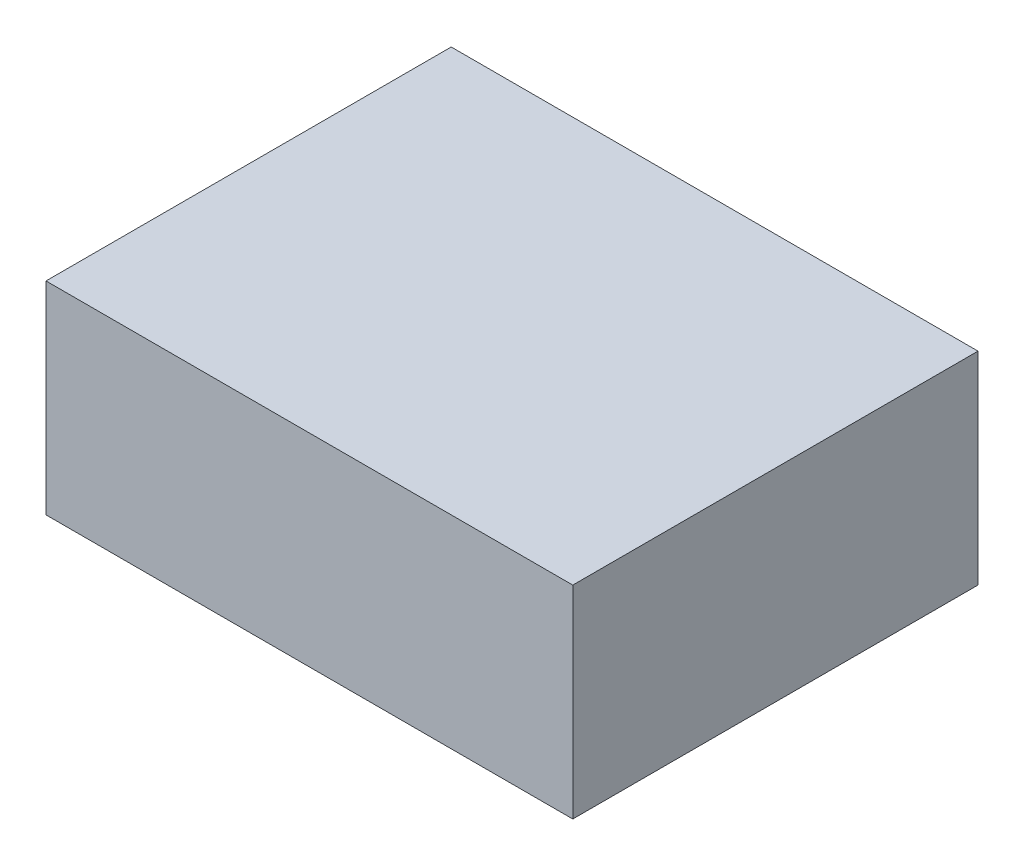
ISO-10303-21;
HEADER;
FILE_DESCRIPTION(('STEP AP214'),'2;1');
FILE_NAME('part.step','',(''),(''),'','','');
FILE_SCHEMA(('AUTOMOTIVE_DESIGN { 1 0 10303 214 1 1 1 1 }'));
ENDSEC;
DATA;
#1=APPLICATION_CONTEXT('core data for automotive mechanical design processes');
#2=APPLICATION_PROTOCOL_DEFINITION('international standard','automotive_design',2000,#1);
#3=PRODUCT_CONTEXT('',#1,'mechanical');
#4=PRODUCT('Part','Part','',(#3));
#5=PRODUCT_RELATED_PRODUCT_CATEGORY('part','',(#4));
#6=PRODUCT_DEFINITION_FORMATION('','',#4);
#7=PRODUCT_DEFINITION_CONTEXT('part definition',#1,'design');
#8=PRODUCT_DEFINITION('design','',#6,#7);
#9=PRODUCT_DEFINITION_SHAPE('','',#8);
#10=(LENGTH_UNIT() NAMED_UNIT(*) SI_UNIT(.MILLI.,.METRE.));
#11=(NAMED_UNIT(*) PLANE_ANGLE_UNIT() SI_UNIT($,.RADIAN.));
#12=(NAMED_UNIT(*) SI_UNIT($,.STERADIAN.) SOLID_ANGLE_UNIT());
#13=UNCERTAINTY_MEASURE_WITH_UNIT(LENGTH_MEASURE(1.E-05),#10,'distance_accuracy_value','');
#14=(GEOMETRIC_REPRESENTATION_CONTEXT(3) GLOBAL_UNCERTAINTY_ASSIGNED_CONTEXT((#13)) GLOBAL_UNIT_ASSIGNED_CONTEXT((#10,
#11,#12)) REPRESENTATION_CONTEXT('',''));
#15=CARTESIAN_POINT('',(0.,0.,0.));
#16=DIRECTION('',(0.,0.,1.));
#17=DIRECTION('',(1.,0.,0.));
#18=AXIS2_PLACEMENT_3D('',#15,#16,#17);
#19=CARTESIAN_POINT('',(32.5,25.,25.));
#20=DIRECTION('',(-1.,0.,0.));
#21=DIRECTION('',(0.,0.,1.));
#22=AXIS2_PLACEMENT_3D('',#19,#20,#21);
#23=PLANE('',#22);
#24=DIRECTION('',(0.,0.,-1.));
#25=VECTOR('',#24,1.);
#26=CARTESIAN_POINT('',(32.5,0.,25.));
#27=LINE('',#26,#25);
#28=CARTESIAN_POINT('',(32.5,0.,25.));
#29=VERTEX_POINT('',#28);
#30=CARTESIAN_POINT('',(32.5,0.,-25.));
#31=VERTEX_POINT('',#30);
#32=EDGE_CURVE('E103',#29,#31,#27,.T.);
#33=ORIENTED_EDGE('',*,*,#32,.T.);
#34=DIRECTION('',(0.,-1.,0.));
#35=VECTOR('',#34,1.);
#36=CARTESIAN_POINT('',(32.5,25.,-25.));
#37=LINE('',#36,#35);
#38=CARTESIAN_POINT('',(32.5,25.,-25.));
#39=VERTEX_POINT('',#38);
#40=EDGE_CURVE('E45',#39,#31,#37,.T.);
#41=ORIENTED_EDGE('',*,*,#40,.F.);
#42=DIRECTION('',(0.,0.,-1.));
#43=VECTOR('',#42,1.);
#44=CARTESIAN_POINT('',(32.5,25.,25.));
#45=LINE('',#44,#43);
#46=CARTESIAN_POINT('',(32.5,25.,25.));
#47=VERTEX_POINT('',#46);
#48=EDGE_CURVE('E89',#47,#39,#45,.T.);
#49=ORIENTED_EDGE('',*,*,#48,.F.);
#50=DIRECTION('',(0.,-1.,0.));
#51=VECTOR('',#50,1.);
#52=CARTESIAN_POINT('',(32.5,25.,25.));
#53=LINE('',#52,#51);
#54=EDGE_CURVE('E99',#47,#29,#53,.T.);
#55=ORIENTED_EDGE('',*,*,#54,.T.);
#56=EDGE_LOOP('',(#33,#41,#49,#55));
#57=FACE_BOUND('',#56,.T.);
#58=ADVANCED_FACE('F37',(#57),#23,.F.);
#59=CARTESIAN_POINT('',(-32.5,25.,-25.));
#60=DIRECTION('',(0.,0.,1.));
#61=DIRECTION('',(1.,0.,0.));
#62=AXIS2_PLACEMENT_3D('',#59,#60,#61);
#63=PLANE('',#62);
#64=DIRECTION('',(-1.,0.,0.));
#65=VECTOR('',#64,1.);
#66=CARTESIAN_POINT('',(-32.5,0.,-25.));
#67=LINE('',#66,#65);
#68=CARTESIAN_POINT('',(-32.5,0.,-25.));
#69=VERTEX_POINT('',#68);
#70=EDGE_CURVE('E94',#31,#69,#67,.T.);
#71=ORIENTED_EDGE('',*,*,#70,.T.);
#72=DIRECTION('',(0.,-1.,0.));
#73=VECTOR('',#72,1.);
#74=CARTESIAN_POINT('',(-32.5,25.,-25.));
#75=LINE('',#74,#73);
#76=CARTESIAN_POINT('',(-32.5,25.,-25.));
#77=VERTEX_POINT('',#76);
#78=EDGE_CURVE('E92',#77,#69,#75,.T.);
#79=ORIENTED_EDGE('',*,*,#78,.F.);
#80=DIRECTION('',(-1.,0.,0.));
#81=VECTOR('',#80,1.);
#82=CARTESIAN_POINT('',(-32.5,25.,-25.));
#83=LINE('',#82,#81);
#84=EDGE_CURVE('E84',#39,#77,#83,.T.);
#85=ORIENTED_EDGE('',*,*,#84,.F.);
#86=ORIENTED_EDGE('',*,*,#40,.T.);
#87=EDGE_LOOP('',(#71,#79,#85,#86));
#88=FACE_BOUND('',#87,.T.);
#89=ADVANCED_FACE('F93',(#88),#63,.F.);
#90=CARTESIAN_POINT('',(-32.5,25.,25.));
#91=DIRECTION('',(1.,0.,0.));
#92=DIRECTION('',(0.,0.,-1.));
#93=AXIS2_PLACEMENT_3D('',#90,#91,#92);
#94=PLANE('',#93);
#95=DIRECTION('',(0.,0.,1.));
#96=VECTOR('',#95,1.);
#97=CARTESIAN_POINT('',(-32.5,0.,25.));
#98=LINE('',#97,#96);
#99=CARTESIAN_POINT('',(-32.5,0.,25.));
#100=VERTEX_POINT('',#99);
#101=EDGE_CURVE('E70',#69,#100,#98,.T.);
#102=ORIENTED_EDGE('',*,*,#101,.T.);
#103=DIRECTION('',(0.,-1.,0.));
#104=VECTOR('',#103,1.);
#105=CARTESIAN_POINT('',(-32.5,25.,25.));
#106=LINE('',#105,#104);
#107=CARTESIAN_POINT('',(-32.5,25.,25.));
#108=VERTEX_POINT('',#107);
#109=EDGE_CURVE('E95',#108,#100,#106,.T.);
#110=ORIENTED_EDGE('',*,*,#109,.F.);
#111=DIRECTION('',(0.,0.,1.));
#112=VECTOR('',#111,1.);
#113=CARTESIAN_POINT('',(-32.5,25.,25.));
#114=LINE('',#113,#112);
#115=EDGE_CURVE('E87',#77,#108,#114,.T.);
#116=ORIENTED_EDGE('',*,*,#115,.F.);
#117=ORIENTED_EDGE('',*,*,#78,.T.);
#118=EDGE_LOOP('',(#102,#110,#116,#117));
#119=FACE_BOUND('',#118,.T.);
#120=ADVANCED_FACE('F97',(#119),#94,.F.);
#121=CARTESIAN_POINT('',(-32.5,25.,25.));
#122=DIRECTION('',(0.,0.,-1.));
#123=DIRECTION('',(-1.,0.,0.));
#124=AXIS2_PLACEMENT_3D('',#121,#122,#123);
#125=PLANE('',#124);
#126=DIRECTION('',(1.,0.,0.));
#127=VECTOR('',#126,1.);
#128=CARTESIAN_POINT('',(-32.5,0.,25.));
#129=LINE('',#128,#127);
#130=EDGE_CURVE('E76',#100,#29,#129,.T.);
#131=ORIENTED_EDGE('',*,*,#130,.T.);
#132=ORIENTED_EDGE('',*,*,#54,.F.);
#133=DIRECTION('',(1.,0.,0.));
#134=VECTOR('',#133,1.);
#135=CARTESIAN_POINT('',(-32.5,25.,25.));
#136=LINE('',#135,#134);
#137=EDGE_CURVE('E53',#108,#47,#136,.T.);
#138=ORIENTED_EDGE('',*,*,#137,.F.);
#139=ORIENTED_EDGE('',*,*,#109,.T.);
#140=EDGE_LOOP('',(#131,#132,#138,#139));
#141=FACE_BOUND('',#140,.T.);
#142=ADVANCED_FACE('F127',(#141),#125,.F.);
#143=CARTESIAN_POINT('',(0.,25.,0.));
#144=DIRECTION('',(0.,-1.,0.));
#145=DIRECTION('',(0.,0.,-1.));
#146=AXIS2_PLACEMENT_3D('',#143,#144,#145);
#147=PLANE('',#146);
#148=ORIENTED_EDGE('',*,*,#48,.T.);
#149=ORIENTED_EDGE('',*,*,#84,.T.);
#150=ORIENTED_EDGE('',*,*,#115,.T.);
#151=ORIENTED_EDGE('',*,*,#137,.T.);
#152=EDGE_LOOP('',(#148,#149,#150,#151));
#153=FACE_BOUND('',#152,.T.);
#154=ADVANCED_FACE('F85',(#153),#147,.F.);
#155=CARTESIAN_POINT('',(0.,0.,0.));
#156=DIRECTION('',(0.,-1.,0.));
#157=DIRECTION('',(0.,0.,-1.));
#158=AXIS2_PLACEMENT_3D('',#155,#156,#157);
#159=PLANE('',#158);
#160=CARTESIAN_POINT('',(-17.5,0.,0.));
#161=DIRECTION('',(0.,-1.,0.));
#162=DIRECTION('',(0.,0.,-1.));
#163=AXIS2_PLACEMENT_3D('',#160,#161,#162);
#164=CIRCLE('',#163,10.);
#165=CARTESIAN_POINT('',(-17.5,0.,-10.));
#166=VERTEX_POINT('',#165);
#167=EDGE_CURVE('E195',#166,#166,#164,.T.);
#168=ORIENTED_EDGE('',*,*,#167,.F.);
#169=EDGE_LOOP('',(#168));
#170=FACE_BOUND('',#169,.T.);
#171=ORIENTED_EDGE('',*,*,#32,.F.);
#172=ORIENTED_EDGE('',*,*,#130,.F.);
#173=ORIENTED_EDGE('',*,*,#101,.F.);
#174=ORIENTED_EDGE('',*,*,#70,.F.);
#175=EDGE_LOOP('',(#171,#172,#173,#174));
#176=FACE_BOUND('',#175,.T.);
#177=ADVANCED_FACE('F114',(#170,#176),#159,.T.);
#178=CARTESIAN_POINT('',(-17.5,-10.,0.));
#179=DIRECTION('',(0.,-1.,0.));
#180=DIRECTION('',(0.,0.,-1.));
#181=AXIS2_PLACEMENT_3D('',#178,#179,#180);
#182=PLANE('',#181);
#183=CARTESIAN_POINT('',(-17.5,-10.,0.));
#184=DIRECTION('',(0.,-1.,0.));
#185=DIRECTION('',(0.,0.,-1.));
#186=AXIS2_PLACEMENT_3D('',#183,#184,#185);
#187=CIRCLE('',#186,10.);
#188=CARTESIAN_POINT('',(-17.5,-10.,-10.));
#189=VERTEX_POINT('',#188);
#190=EDGE_CURVE('E106',#189,#189,#187,.T.);
#191=ORIENTED_EDGE('',*,*,#190,.T.);
#192=EDGE_LOOP('',(#191));
#193=FACE_BOUND('',#192,.T.);
#194=CARTESIAN_POINT('',(-17.5,-10.,0.));
#195=DIRECTION('',(0.,-1.,0.));
#196=DIRECTION('',(0.,0.,-1.));
#197=AXIS2_PLACEMENT_3D('',#194,#195,#196);
#198=CIRCLE('',#197,5.);
#199=CARTESIAN_POINT('',(-17.5,-10.,-5.));
#200=VERTEX_POINT('',#199);
#201=EDGE_CURVE('E192',#200,#200,#198,.T.);
#202=ORIENTED_EDGE('',*,*,#201,.F.);
#203=EDGE_LOOP('',(#202));
#204=FACE_BOUND('',#203,.T.);
#205=ADVANCED_FACE('F116',(#193,#204),#182,.T.);
#206=CARTESIAN_POINT('',(-17.5,-10.,0.));
#207=DIRECTION('',(0.,1.,0.));
#208=DIRECTION('',(0.,0.,1.));
#209=AXIS2_PLACEMENT_3D('',#206,#207,#208);
#210=CYLINDRICAL_SURFACE('',#209,10.);
#211=ORIENTED_EDGE('',*,*,#190,.F.);
#212=EDGE_LOOP('',(#211));
#213=FACE_BOUND('',#212,.T.);
#214=ORIENTED_EDGE('',*,*,#167,.T.);
#215=EDGE_LOOP('',(#214));
#216=FACE_BOUND('',#215,.T.);
#217=ADVANCED_FACE('F124',(#213,#216),#210,.T.);
#218=CARTESIAN_POINT('',(-17.5,-10.,0.));
#219=DIRECTION('',(0.,1.,0.));
#220=DIRECTION('',(0.,0.,1.));
#221=AXIS2_PLACEMENT_3D('',#218,#219,#220);
#222=CYLINDRICAL_SURFACE('',#221,5.);
#223=ORIENTED_EDGE('',*,*,#201,.T.);
#224=EDGE_LOOP('',(#223));
#225=FACE_BOUND('',#224,.T.);
#226=CARTESIAN_POINT('',(-17.5,0.,0.));
#227=DIRECTION('',(0.,-1.,0.));
#228=DIRECTION('',(0.,0.,-1.));
#229=AXIS2_PLACEMENT_3D('',#226,#227,#228);
#230=CIRCLE('',#229,5.);
#231=CARTESIAN_POINT('',(-17.5,0.,-5.));
#232=VERTEX_POINT('',#231);
#233=EDGE_CURVE('E11',#232,#232,#230,.F.);
#234=ORIENTED_EDGE('',*,*,#233,.T.);
#235=EDGE_LOOP('',(#234));
#236=FACE_BOUND('',#235,.T.);
#237=ADVANCED_FACE('F132',(#225,#236),#222,.F.);
#238=ORIENTED_EDGE('',*,*,#233,.F.);
#239=EDGE_LOOP('',(#238));
#240=FACE_BOUND('',#239,.T.);
#241=ADVANCED_FACE('F119',(#240),#159,.T.);
#242=CLOSED_SHELL('',(#58,#89,#120,#142,#154,#177,#205,#217,#237,#241));
#243=MANIFOLD_SOLID_BREP('B2',#242);
#244=ADVANCED_BREP_SHAPE_REPRESENTATION('',(#18,#243),#14);
#245=SHAPE_DEFINITION_REPRESENTATION(#9,#244);
ENDSEC;
END-ISO-10303-21;
